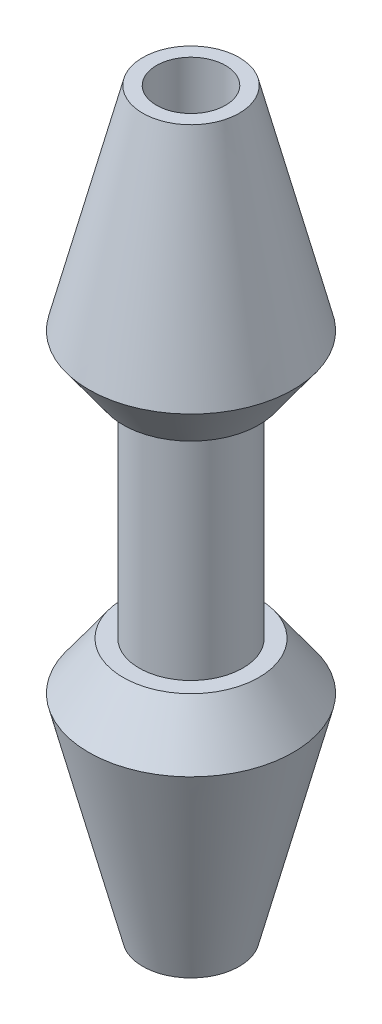
ISO-10303-21;
HEADER;
FILE_DESCRIPTION(('STEP AP214'),'2;1');
FILE_NAME('part.step','',(''),(''),'','','');
FILE_SCHEMA(('AUTOMOTIVE_DESIGN { 1 0 10303 214 1 1 1 1 }'));
ENDSEC;
DATA;
#1=APPLICATION_CONTEXT('core data for automotive mechanical design processes');
#2=APPLICATION_PROTOCOL_DEFINITION('international standard','automotive_design',2000,#1);
#3=PRODUCT_CONTEXT('',#1,'mechanical');
#4=PRODUCT('Part','Part','',(#3));
#5=PRODUCT_RELATED_PRODUCT_CATEGORY('part','',(#4));
#6=PRODUCT_DEFINITION_FORMATION('','',#4);
#7=PRODUCT_DEFINITION_CONTEXT('part definition',#1,'design');
#8=PRODUCT_DEFINITION('design','',#6,#7);
#9=PRODUCT_DEFINITION_SHAPE('','',#8);
#10=(LENGTH_UNIT() NAMED_UNIT(*) SI_UNIT(.MILLI.,.METRE.));
#11=(NAMED_UNIT(*) PLANE_ANGLE_UNIT() SI_UNIT($,.RADIAN.));
#12=(NAMED_UNIT(*) SI_UNIT($,.STERADIAN.) SOLID_ANGLE_UNIT());
#13=UNCERTAINTY_MEASURE_WITH_UNIT(LENGTH_MEASURE(1.E-05),#10,'distance_accuracy_value','');
#14=(GEOMETRIC_REPRESENTATION_CONTEXT(3) GLOBAL_UNCERTAINTY_ASSIGNED_CONTEXT((#13)) GLOBAL_UNIT_ASSIGNED_CONTEXT((#10,
#11,#12)) REPRESENTATION_CONTEXT('',''));
#15=CARTESIAN_POINT('',(0.,0.,0.));
#16=DIRECTION('',(0.,0.,1.));
#17=DIRECTION('',(1.,0.,0.));
#18=AXIS2_PLACEMENT_3D('',#15,#16,#17);
#19=CARTESIAN_POINT('',(0.,0.,-9.94114612284268));
#20=DIRECTION('',(0.,-1.,0.));
#21=DIRECTION('',(0.,0.,-1.));
#22=AXIS2_PLACEMENT_3D('',#19,#20,#21);
#23=PLANE('',#22);
#24=CARTESIAN_POINT('',(0.,0.,0.));
#25=DIRECTION('',(0.,-1.,0.));
#26=DIRECTION('',(0.,0.,-1.));
#27=AXIS2_PLACEMENT_3D('',#24,#25,#26);
#28=CIRCLE('',#27,4.5);
#29=CARTESIAN_POINT('',(0.,0.,-4.5));
#30=VERTEX_POINT('',#29);
#31=EDGE_CURVE('E10',#30,#30,#28,.T.);
#32=ORIENTED_EDGE('',*,*,#31,.F.);
#33=EDGE_LOOP('',(#32));
#34=FACE_BOUND('',#33,.T.);
#35=CARTESIAN_POINT('',(0.,0.,0.));
#36=DIRECTION('',(0.,-1.,0.));
#37=DIRECTION('',(0.,0.,-1.));
#38=AXIS2_PLACEMENT_3D('',#35,#36,#37);
#39=CIRCLE('',#38,5.90232073091279);
#40=CARTESIAN_POINT('',(0.,0.,-5.90232073091279));
#41=VERTEX_POINT('',#40);
#42=EDGE_CURVE('E55',#41,#41,#39,.T.);
#43=ORIENTED_EDGE('',*,*,#42,.T.);
#44=EDGE_LOOP('',(#43));
#45=FACE_BOUND('',#44,.T.);
#46=ADVANCED_FACE('F40',(#34,#45),#23,.T.);
#47=CARTESIAN_POINT('',(0.,22.5979958944993,0.));
#48=DIRECTION('',(0.,1.,0.));
#49=DIRECTION('',(0.,0.,1.));
#50=AXIS2_PLACEMENT_3D('',#47,#48,#49);
#51=PLANE('',#50);
#52=CARTESIAN_POINT('',(0.,22.5979958944993,0.));
#53=DIRECTION('',(0.,1.,0.));
#54=DIRECTION('',(0.,0.,1.));
#55=AXIS2_PLACEMENT_3D('',#52,#53,#54);
#56=CIRCLE('',#55,3.);
#57=CARTESIAN_POINT('',(0.,22.5979958944993,3.));
#58=VERTEX_POINT('',#57);
#59=EDGE_CURVE('E117',#58,#58,#56,.T.);
#60=ORIENTED_EDGE('',*,*,#59,.F.);
#61=EDGE_LOOP('',(#60));
#62=FACE_BOUND('',#61,.T.);
#63=CARTESIAN_POINT('',(0.,22.5979958944993,0.));
#64=DIRECTION('',(0.,-1.,0.));
#65=DIRECTION('',(0.,0.,-1.));
#66=AXIS2_PLACEMENT_3D('',#63,#64,#65);
#67=CIRCLE('',#66,4.19316903307146);
#68=CARTESIAN_POINT('',(0.,22.5979958944993,-4.19316903307146));
#69=VERTEX_POINT('',#68);
#70=EDGE_CURVE('E60',#69,#69,#67,.T.);
#71=ORIENTED_EDGE('',*,*,#70,.F.);
#72=EDGE_LOOP('',(#71));
#73=FACE_BOUND('',#72,.T.);
#74=ADVANCED_FACE('F79',(#62,#73),#51,.T.);
#75=CARTESIAN_POINT('',(0.,0.,0.));
#76=DIRECTION('',(0.,-1.,0.));
#77=DIRECTION('',(0.,0.,-1.));
#78=AXIS2_PLACEMENT_3D('',#75,#76,#77);
#79=CONICAL_SURFACE('',#78,9.94114612284268,0.249075921515313);
#80=CARTESIAN_POINT('',(0.,4.14792189069287,0.));
#81=DIRECTION('',(0.,1.,0.));
#82=DIRECTION('',(0.,0.,1.));
#83=AXIS2_PLACEMENT_3D('',#80,#81,#82);
#84=CIRCLE('',#83,8.88608973159575);
#85=CARTESIAN_POINT('',(0.,4.14792189069287,8.88608973159575));
#86=VERTEX_POINT('',#85);
#87=EDGE_CURVE('E45',#86,#86,#84,.T.);
#88=ORIENTED_EDGE('',*,*,#87,.T.);
#89=EDGE_LOOP('',(#88));
#90=FACE_BOUND('',#89,.T.);
#91=ORIENTED_EDGE('',*,*,#70,.T.);
#92=EDGE_LOOP('',(#91));
#93=FACE_BOUND('',#92,.T.);
#94=ADVANCED_FACE('F71',(#90,#93),#79,.T.);
#95=CARTESIAN_POINT('',(0.,0.,0.));
#96=DIRECTION('',(0.,1.,0.));
#97=DIRECTION('',(0.,0.,1.));
#98=AXIS2_PLACEMENT_3D('',#95,#96,#97);
#99=CONICAL_SURFACE('',#98,5.90232073091279,0.623588704481849);
#100=ORIENTED_EDGE('',*,*,#87,.F.);
#101=EDGE_LOOP('',(#100));
#102=FACE_BOUND('',#101,.T.);
#103=ORIENTED_EDGE('',*,*,#42,.F.);
#104=EDGE_LOOP('',(#103));
#105=FACE_BOUND('',#104,.T.);
#106=ADVANCED_FACE('F43',(#102,#105),#99,.T.);
#107=CARTESIAN_POINT('',(0.,-9.5,0.));
#108=DIRECTION('',(0.,1.,0.));
#109=DIRECTION('',(0.,0.,1.));
#110=AXIS2_PLACEMENT_3D('',#107,#108,#109);
#111=CYLINDRICAL_SURFACE('',#110,4.5);
#112=ORIENTED_EDGE('',*,*,#31,.T.);
#113=EDGE_LOOP('',(#112));
#114=FACE_BOUND('',#113,.T.);
#115=CARTESIAN_POINT('',(0.,-19.,0.));
#116=DIRECTION('',(0.,-1.,0.));
#117=DIRECTION('',(0.,0.,-1.));
#118=AXIS2_PLACEMENT_3D('',#115,#116,#117);
#119=CIRCLE('',#118,4.5);
#120=CARTESIAN_POINT('',(0.,-19.,-4.5));
#121=VERTEX_POINT('',#120);
#122=EDGE_CURVE('E63',#121,#121,#119,.T.);
#123=ORIENTED_EDGE('',*,*,#122,.F.);
#124=EDGE_LOOP('',(#123));
#125=FACE_BOUND('',#124,.T.);
#126=ADVANCED_FACE('F70',(#114,#125),#111,.T.);
#127=CARTESIAN_POINT('',(0.,-19.,-9.94114612284268));
#128=DIRECTION('',(0.,1.,0.));
#129=DIRECTION('',(0.,0.,-1.));
#130=AXIS2_PLACEMENT_3D('',#127,#128,#129);
#131=PLANE('',#130);
#132=ORIENTED_EDGE('',*,*,#122,.T.);
#133=EDGE_LOOP('',(#132));
#134=FACE_BOUND('',#133,.T.);
#135=CARTESIAN_POINT('',(0.,-19.,0.));
#136=DIRECTION('',(0.,-1.,0.));
#137=DIRECTION('',(0.,0.,-1.));
#138=AXIS2_PLACEMENT_3D('',#135,#136,#137);
#139=CIRCLE('',#138,5.90232073091279);
#140=CARTESIAN_POINT('',(0.,-19.,-5.90232073091279));
#141=VERTEX_POINT('',#140);
#142=EDGE_CURVE('E129',#141,#141,#139,.T.);
#143=ORIENTED_EDGE('',*,*,#142,.F.);
#144=EDGE_LOOP('',(#143));
#145=FACE_BOUND('',#144,.T.);
#146=ADVANCED_FACE('F77',(#134,#145),#131,.T.);
#147=CARTESIAN_POINT('',(0.,-41.5979958944993,0.));
#148=DIRECTION('',(0.,-1.,0.));
#149=DIRECTION('',(0.,0.,1.));
#150=AXIS2_PLACEMENT_3D('',#147,#148,#149);
#151=PLANE('',#150);
#152=CARTESIAN_POINT('',(0.,-41.5979958944992,0.));
#153=DIRECTION('',(0.,1.,0.));
#154=DIRECTION('',(0.,0.,1.));
#155=AXIS2_PLACEMENT_3D('',#152,#153,#154);
#156=CIRCLE('',#155,3.);
#157=CARTESIAN_POINT('',(0.,-41.5979958944992,3.));
#158=VERTEX_POINT('',#157);
#159=EDGE_CURVE('E114',#158,#158,#156,.T.);
#160=ORIENTED_EDGE('',*,*,#159,.T.);
#161=EDGE_LOOP('',(#160));
#162=FACE_BOUND('',#161,.T.);
#163=CARTESIAN_POINT('',(0.,-41.5979958944993,0.));
#164=DIRECTION('',(0.,-1.,0.));
#165=DIRECTION('',(0.,0.,-1.));
#166=AXIS2_PLACEMENT_3D('',#163,#164,#165);
#167=CIRCLE('',#166,4.19316903307146);
#168=CARTESIAN_POINT('',(0.,-41.5979958944993,-4.19316903307146));
#169=VERTEX_POINT('',#168);
#170=EDGE_CURVE('E121',#169,#169,#167,.T.);
#171=ORIENTED_EDGE('',*,*,#170,.T.);
#172=EDGE_LOOP('',(#171));
#173=FACE_BOUND('',#172,.T.);
#174=ADVANCED_FACE('F99',(#162,#173),#151,.T.);
#175=CARTESIAN_POINT('',(0.,-19.,0.));
#176=DIRECTION('',(0.,1.,0.));
#177=DIRECTION('',(0.,0.,-1.));
#178=AXIS2_PLACEMENT_3D('',#175,#176,#177);
#179=CONICAL_SURFACE('',#178,9.94114612284268,0.249075921515313);
#180=CARTESIAN_POINT('',(0.,-23.1479218906929,0.));
#181=DIRECTION('',(0.,1.,0.));
#182=DIRECTION('',(0.,0.,1.));
#183=AXIS2_PLACEMENT_3D('',#180,#181,#182);
#184=CIRCLE('',#183,8.88608973159575);
#185=CARTESIAN_POINT('',(0.,-23.1479218906929,8.88608973159575));
#186=VERTEX_POINT('',#185);
#187=EDGE_CURVE('E58',#186,#186,#184,.T.);
#188=ORIENTED_EDGE('',*,*,#187,.F.);
#189=EDGE_LOOP('',(#188));
#190=FACE_BOUND('',#189,.T.);
#191=ORIENTED_EDGE('',*,*,#170,.F.);
#192=EDGE_LOOP('',(#191));
#193=FACE_BOUND('',#192,.T.);
#194=ADVANCED_FACE('F95',(#190,#193),#179,.T.);
#195=CARTESIAN_POINT('',(0.,-19.,0.));
#196=DIRECTION('',(0.,-1.,0.));
#197=DIRECTION('',(0.,0.,1.));
#198=AXIS2_PLACEMENT_3D('',#195,#196,#197);
#199=CONICAL_SURFACE('',#198,5.90232073091279,0.623588704481849);
#200=ORIENTED_EDGE('',*,*,#187,.T.);
#201=EDGE_LOOP('',(#200));
#202=FACE_BOUND('',#201,.T.);
#203=ORIENTED_EDGE('',*,*,#142,.T.);
#204=EDGE_LOOP('',(#203));
#205=FACE_BOUND('',#204,.T.);
#206=ADVANCED_FACE('F91',(#202,#205),#199,.T.);
#207=CARTESIAN_POINT('',(0.,-41.5979958944992,0.));
#208=DIRECTION('',(0.,1.,0.));
#209=DIRECTION('',(0.,0.,1.));
#210=AXIS2_PLACEMENT_3D('',#207,#208,#209);
#211=CYLINDRICAL_SURFACE('',#210,3.);
#212=ORIENTED_EDGE('',*,*,#159,.F.);
#213=EDGE_LOOP('',(#212));
#214=FACE_BOUND('',#213,.T.);
#215=ORIENTED_EDGE('',*,*,#59,.T.);
#216=EDGE_LOOP('',(#215));
#217=FACE_BOUND('',#216,.T.);
#218=ADVANCED_FACE('F94',(#214,#217),#211,.F.);
#219=CLOSED_SHELL('',(#46,#74,#94,#106,#126,#146,#174,#194,#206,#218));
#220=MANIFOLD_SOLID_BREP('B2',#219);
#221=ADVANCED_BREP_SHAPE_REPRESENTATION('',(#18,#220),#14);
#222=SHAPE_DEFINITION_REPRESENTATION(#9,#221);
ENDSEC;
END-ISO-10303-21;
